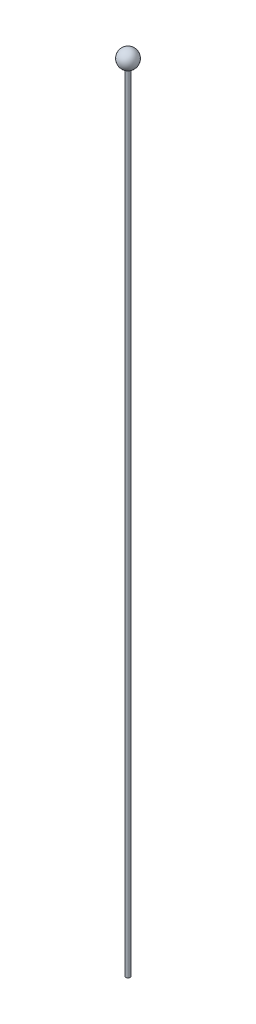
ISO-10303-21;
HEADER;
FILE_DESCRIPTION(('STEP AP214'),'2;1');
FILE_NAME('part.step','',(''),(''),'','','');
FILE_SCHEMA(('AUTOMOTIVE_DESIGN { 1 0 10303 214 1 1 1 1 }'));
ENDSEC;
DATA;
#1=APPLICATION_CONTEXT('core data for automotive mechanical design processes');
#2=APPLICATION_PROTOCOL_DEFINITION('international standard','automotive_design',2000,#1);
#3=PRODUCT_CONTEXT('',#1,'mechanical');
#4=PRODUCT('Part','Part','',(#3));
#5=PRODUCT_RELATED_PRODUCT_CATEGORY('part','',(#4));
#6=PRODUCT_DEFINITION_FORMATION('','',#4);
#7=PRODUCT_DEFINITION_CONTEXT('part definition',#1,'design');
#8=PRODUCT_DEFINITION('design','',#6,#7);
#9=PRODUCT_DEFINITION_SHAPE('','',#8);
#10=(LENGTH_UNIT() NAMED_UNIT(*) SI_UNIT(.MILLI.,.METRE.));
#11=(NAMED_UNIT(*) PLANE_ANGLE_UNIT() SI_UNIT($,.RADIAN.));
#12=(NAMED_UNIT(*) SI_UNIT($,.STERADIAN.) SOLID_ANGLE_UNIT());
#13=UNCERTAINTY_MEASURE_WITH_UNIT(LENGTH_MEASURE(1.E-05),#10,'distance_accuracy_value','');
#14=(GEOMETRIC_REPRESENTATION_CONTEXT(3) GLOBAL_UNCERTAINTY_ASSIGNED_CONTEXT((#13)) GLOBAL_UNIT_ASSIGNED_CONTEXT((#10,
#11,#12)) REPRESENTATION_CONTEXT('',''));
#15=CARTESIAN_POINT('',(0.,0.,0.));
#16=DIRECTION('',(0.,0.,1.));
#17=DIRECTION('',(1.,0.,0.));
#18=AXIS2_PLACEMENT_3D('',#15,#16,#17);
#19=CARTESIAN_POINT('',(0.250000000000037,0.,0.));
#20=DIRECTION('',(0.,-1.,0.));
#21=DIRECTION('',(0.,0.,-1.));
#22=AXIS2_PLACEMENT_3D('',#19,#20,#21);
#23=PLANE('',#22);
#24=CARTESIAN_POINT('',(0.,0.,0.));
#25=DIRECTION('',(0.,-1.,0.));
#26=DIRECTION('',(0.,0.,-1.));
#27=AXIS2_PLACEMENT_3D('',#24,#25,#26);
#28=CIRCLE('',#27,0.250000000000037);
#29=CARTESIAN_POINT('',(0.,0.,-0.250000000000037));
#30=VERTEX_POINT('',#29);
#31=EDGE_CURVE('E10',#30,#30,#28,.T.);
#32=ORIENTED_EDGE('',*,*,#31,.T.);
#33=EDGE_LOOP('',(#32));
#34=FACE_BOUND('',#33,.T.);
#35=ADVANCED_FACE('F32',(#34),#23,.T.);
#36=CARTESIAN_POINT('',(0.,0.,0.));
#37=DIRECTION('',(0.,-1.,0.));
#38=DIRECTION('',(0.,0.,-1.));
#39=AXIS2_PLACEMENT_3D('',#36,#37,#38);
#40=CYLINDRICAL_SURFACE('',#39,0.25000000000002);
#41=CARTESIAN_POINT('',(0.,89.0317541634481,0.));
#42=DIRECTION('',(0.,-1.,0.));
#43=DIRECTION('',(0.,0.,-1.));
#44=AXIS2_PLACEMENT_3D('',#41,#42,#43);
#45=CIRCLE('',#44,0.250000000000003);
#46=CARTESIAN_POINT('',(0.,89.0317541634481,-0.250000000000003));
#47=VERTEX_POINT('',#46);
#48=EDGE_CURVE('E38',#47,#47,#45,.T.);
#49=ORIENTED_EDGE('',*,*,#48,.T.);
#50=EDGE_LOOP('',(#49));
#51=FACE_BOUND('',#50,.T.);
#52=ORIENTED_EDGE('',*,*,#31,.F.);
#53=EDGE_LOOP('',(#52));
#54=FACE_BOUND('',#53,.T.);
#55=ADVANCED_FACE('F44',(#51,#54),#40,.T.);
#56=CARTESIAN_POINT('',(0.,90.,0.));
#57=DIRECTION('',(0.,-1.,0.));
#58=DIRECTION('',(1.,0.,0.));
#59=AXIS2_PLACEMENT_3D('',#56,#57,#58);
#60=SPHERICAL_SURFACE('',#59,0.999999999999998);
#61=ORIENTED_EDGE('',*,*,#48,.F.);
#62=EDGE_LOOP('',(#61));
#63=FACE_BOUND('',#62,.T.);
#64=ADVANCED_FACE('F47',(#63),#60,.T.);
#65=CLOSED_SHELL('',(#35,#55,#64));
#66=MANIFOLD_SOLID_BREP('B2',#65);
#67=ADVANCED_BREP_SHAPE_REPRESENTATION('',(#18,#66),#14);
#68=SHAPE_DEFINITION_REPRESENTATION(#9,#67);
ENDSEC;
END-ISO-10303-21;
